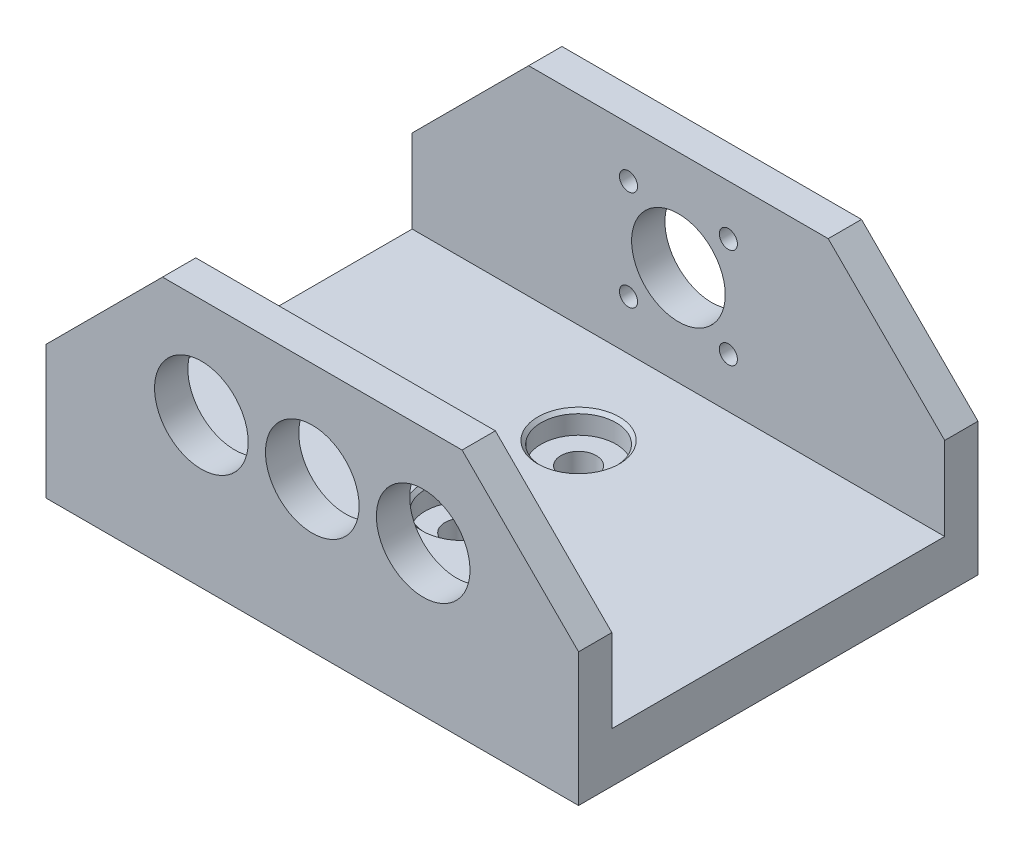
ISO-10303-21;
HEADER;
FILE_DESCRIPTION(('STEP AP214'),'2;1');
FILE_NAME('part.step','',(''),(''),'','','');
FILE_SCHEMA(('AUTOMOTIVE_DESIGN { 1 0 10303 214 1 1 1 1 }'));
ENDSEC;
DATA;
#1=APPLICATION_CONTEXT('core data for automotive mechanical design processes');
#2=APPLICATION_PROTOCOL_DEFINITION('international standard','automotive_design',2000,#1);
#3=PRODUCT_CONTEXT('',#1,'mechanical');
#4=PRODUCT('Part','Part','',(#3));
#5=PRODUCT_RELATED_PRODUCT_CATEGORY('part','',(#4));
#6=PRODUCT_DEFINITION_FORMATION('','',#4);
#7=PRODUCT_DEFINITION_CONTEXT('part definition',#1,'design');
#8=PRODUCT_DEFINITION('design','',#6,#7);
#9=PRODUCT_DEFINITION_SHAPE('','',#8);
#10=(LENGTH_UNIT() NAMED_UNIT(*) SI_UNIT(.MILLI.,.METRE.));
#11=(NAMED_UNIT(*) PLANE_ANGLE_UNIT() SI_UNIT($,.RADIAN.));
#12=(NAMED_UNIT(*) SI_UNIT($,.STERADIAN.) SOLID_ANGLE_UNIT());
#13=UNCERTAINTY_MEASURE_WITH_UNIT(LENGTH_MEASURE(1.E-05),#10,'distance_accuracy_value','');
#14=(GEOMETRIC_REPRESENTATION_CONTEXT(3) GLOBAL_UNCERTAINTY_ASSIGNED_CONTEXT((#13)) GLOBAL_UNIT_ASSIGNED_CONTEXT((#10,
#11,#12)) REPRESENTATION_CONTEXT('',''));
#15=CARTESIAN_POINT('',(0.,0.,0.));
#16=DIRECTION('',(0.,0.,1.));
#17=DIRECTION('',(1.,0.,0.));
#18=AXIS2_PLACEMENT_3D('',#15,#16,#17);
#19=CARTESIAN_POINT('',(0.,50.8,0.));
#20=DIRECTION('',(-1.,0.,0.));
#21=DIRECTION('',(0.,0.,1.));
#22=AXIS2_PLACEMENT_3D('',#19,#20,#21);
#23=PLANE('',#22);
#24=DIRECTION('',(0.,0.,1.));
#25=VECTOR('',#24,1.);
#26=CARTESIAN_POINT('',(0.,25.4,-76.2));
#27=LINE('',#26,#25);
#28=CARTESIAN_POINT('',(0.,25.4,-76.2));
#29=VERTEX_POINT('',#28);
#30=CARTESIAN_POINT('',(0.,25.4,-69.85));
#31=VERTEX_POINT('',#30);
#32=EDGE_CURVE('E57',#29,#31,#27,.T.);
#33=ORIENTED_EDGE('',*,*,#32,.F.);
#34=DIRECTION('',(0.,-1.,0.));
#35=VECTOR('',#34,1.);
#36=CARTESIAN_POINT('',(0.,50.8,-76.2));
#37=LINE('',#36,#35);
#38=CARTESIAN_POINT('',(0.,0.,-76.2));
#39=VERTEX_POINT('',#38);
#40=EDGE_CURVE('E134',#29,#39,#37,.T.);
#41=ORIENTED_EDGE('',*,*,#40,.T.);
#42=DIRECTION('',(0.,0.,-1.));
#43=VECTOR('',#42,1.);
#44=CARTESIAN_POINT('',(0.,0.,0.));
#45=LINE('',#44,#43);
#46=CARTESIAN_POINT('',(0.,0.,0.));
#47=VERTEX_POINT('',#46);
#48=EDGE_CURVE('E203',#47,#39,#45,.T.);
#49=ORIENTED_EDGE('',*,*,#48,.F.);
#50=DIRECTION('',(0.,-1.,0.));
#51=VECTOR('',#50,1.);
#52=CARTESIAN_POINT('',(0.,50.8,0.));
#53=LINE('',#52,#51);
#54=CARTESIAN_POINT('',(0.,25.4,0.));
#55=VERTEX_POINT('',#54);
#56=EDGE_CURVE('E162',#55,#47,#53,.T.);
#57=ORIENTED_EDGE('',*,*,#56,.F.);
#58=CARTESIAN_POINT('',(0.,25.4,-6.35000000000004));
#59=VERTEX_POINT('',#58);
#60=EDGE_CURVE('E138',#59,#55,#27,.T.);
#61=ORIENTED_EDGE('',*,*,#60,.F.);
#62=DIRECTION('',(0.,-1.,0.));
#63=VECTOR('',#62,1.);
#64=CARTESIAN_POINT('',(0.,50.8,-6.35));
#65=LINE('',#64,#63);
#66=CARTESIAN_POINT('',(0.,9.525,-6.35));
#67=VERTEX_POINT('',#66);
#68=EDGE_CURVE('E188',#59,#67,#65,.T.);
#69=ORIENTED_EDGE('',*,*,#68,.T.);
#70=DIRECTION('',(0.,0.,-1.));
#71=VECTOR('',#70,1.);
#72=CARTESIAN_POINT('',(0.,9.525,-6.35));
#73=LINE('',#72,#71);
#74=CARTESIAN_POINT('',(0.,9.525,-69.85));
#75=VERTEX_POINT('',#74);
#76=EDGE_CURVE('E201',#67,#75,#73,.T.);
#77=ORIENTED_EDGE('',*,*,#76,.T.);
#78=DIRECTION('',(0.,-1.,0.));
#79=VECTOR('',#78,1.);
#80=CARTESIAN_POINT('',(0.,50.8,-69.85));
#81=LINE('',#80,#79);
#82=EDGE_CURVE('E137',#31,#75,#81,.T.);
#83=ORIENTED_EDGE('',*,*,#82,.F.);
#84=EDGE_LOOP('',(#33,#41,#49,#57,#61,#69,#77,#83));
#85=FACE_BOUND('',#84,.T.);
#86=ADVANCED_FACE('F35',(#85),#23,.T.);
#87=CARTESIAN_POINT('',(0.,50.8,0.));
#88=DIRECTION('',(0.,0.,-1.));
#89=DIRECTION('',(-1.,0.,0.));
#90=AXIS2_PLACEMENT_3D('',#87,#88,#89);
#91=PLANE('',#90);
#92=CARTESIAN_POINT('',(29.6418,28.5242,0.));
#93=DIRECTION('',(0.,0.,1.));
#94=DIRECTION('',(1.,0.,0.));
#95=AXIS2_PLACEMENT_3D('',#92,#93,#94);
#96=CIRCLE('',#95,8.92975099999999);
#97=CARTESIAN_POINT('',(38.571551,28.5242,0.));
#98=VERTEX_POINT('',#97);
#99=EDGE_CURVE('E334',#98,#98,#96,.T.);
#100=ORIENTED_EDGE('',*,*,#99,.F.);
#101=EDGE_LOOP('',(#100));
#102=FACE_BOUND('',#101,.T.);
#103=CARTESIAN_POINT('',(71.9582,28.5242,0.));
#104=DIRECTION('',(0.,0.,1.));
#105=DIRECTION('',(1.,0.,0.));
#106=AXIS2_PLACEMENT_3D('',#103,#104,#105);
#107=CIRCLE('',#106,8.92975099999999);
#108=CARTESIAN_POINT('',(80.887951,28.5242,0.));
#109=VERTEX_POINT('',#108);
#110=EDGE_CURVE('E340',#109,#109,#107,.T.);
#111=ORIENTED_EDGE('',*,*,#110,.F.);
#112=EDGE_LOOP('',(#111));
#113=FACE_BOUND('',#112,.T.);
#114=CARTESIAN_POINT('',(50.8,28.5242,0.));
#115=DIRECTION('',(0.,0.,1.));
#116=DIRECTION('',(1.,0.,0.));
#117=AXIS2_PLACEMENT_3D('',#114,#115,#116);
#118=CIRCLE('',#117,8.92975099999999);
#119=CARTESIAN_POINT('',(59.729751,28.5242,0.));
#120=VERTEX_POINT('',#119);
#121=EDGE_CURVE('E346',#120,#120,#118,.T.);
#122=ORIENTED_EDGE('',*,*,#121,.F.);
#123=EDGE_LOOP('',(#122));
#124=FACE_BOUND('',#123,.T.);
#125=DIRECTION('',(0.,-1.,0.));
#126=VECTOR('',#125,1.);
#127=CARTESIAN_POINT('',(101.6,50.8,0.));
#128=LINE('',#127,#126);
#129=CARTESIAN_POINT('',(101.6,25.4,0.));
#130=VERTEX_POINT('',#129);
#131=CARTESIAN_POINT('',(101.6,0.,0.));
#132=VERTEX_POINT('',#131);
#133=EDGE_CURVE('E149',#130,#132,#128,.T.);
#134=ORIENTED_EDGE('',*,*,#133,.F.);
#135=DIRECTION('',(0.707106781186548,-0.707106781186547,0.));
#136=VECTOR('',#135,1.);
#137=CARTESIAN_POINT('',(79.3749999999999,47.625,0.));
#138=LINE('',#137,#136);
#139=CARTESIAN_POINT('',(79.3749999999999,47.625,0.));
#140=VERTEX_POINT('',#139);
#141=EDGE_CURVE('E129',#140,#130,#138,.T.);
#142=ORIENTED_EDGE('',*,*,#141,.F.);
#143=DIRECTION('',(1.,0.,0.));
#144=VECTOR('',#143,1.);
#145=CARTESIAN_POINT('',(22.2250000000001,47.625,0.));
#146=LINE('',#145,#144);
#147=CARTESIAN_POINT('',(22.2250000000001,47.625,0.));
#148=VERTEX_POINT('',#147);
#149=EDGE_CURVE('E292',#148,#140,#146,.T.);
#150=ORIENTED_EDGE('',*,*,#149,.F.);
#151=DIRECTION('',(0.707106781186549,0.707106781186546,0.));
#152=VECTOR('',#151,1.);
#153=CARTESIAN_POINT('',(0.,25.4,0.));
#154=LINE('',#153,#152);
#155=EDGE_CURVE('E283',#55,#148,#154,.T.);
#156=ORIENTED_EDGE('',*,*,#155,.F.);
#157=ORIENTED_EDGE('',*,*,#56,.T.);
#158=DIRECTION('',(1.,0.,0.));
#159=VECTOR('',#158,1.);
#160=CARTESIAN_POINT('',(0.,0.,0.));
#161=LINE('',#160,#159);
#162=EDGE_CURVE('E147',#47,#132,#161,.T.);
#163=ORIENTED_EDGE('',*,*,#162,.T.);
#164=EDGE_LOOP('',(#134,#142,#150,#156,#157,#163));
#165=FACE_BOUND('',#164,.T.);
#166=ADVANCED_FACE('F216',(#102,#113,#124,#165),#91,.F.);
#167=CARTESIAN_POINT('',(101.6,50.8,0.));
#168=DIRECTION('',(-1.,0.,0.));
#169=DIRECTION('',(0.,0.,1.));
#170=AXIS2_PLACEMENT_3D('',#167,#168,#169);
#171=PLANE('',#170);
#172=DIRECTION('',(0.,-1.,0.));
#173=VECTOR('',#172,1.);
#174=CARTESIAN_POINT('',(101.6,50.8,-76.2));
#175=LINE('',#174,#173);
#176=CARTESIAN_POINT('',(101.6,25.4,-76.2));
#177=VERTEX_POINT('',#176);
#178=CARTESIAN_POINT('',(101.6,0.,-76.2));
#179=VERTEX_POINT('',#178);
#180=EDGE_CURVE('E146',#177,#179,#175,.T.);
#181=ORIENTED_EDGE('',*,*,#180,.F.);
#182=DIRECTION('',(0.,0.,1.));
#183=VECTOR('',#182,1.);
#184=CARTESIAN_POINT('',(101.6,25.4,-76.2));
#185=LINE('',#184,#183);
#186=CARTESIAN_POINT('',(101.6,25.4,-69.85));
#187=VERTEX_POINT('',#186);
#188=EDGE_CURVE('E296',#177,#187,#185,.T.);
#189=ORIENTED_EDGE('',*,*,#188,.T.);
#190=DIRECTION('',(0.,1.,0.));
#191=VECTOR('',#190,1.);
#192=CARTESIAN_POINT('',(101.6,50.8,-69.85));
#193=LINE('',#192,#191);
#194=CARTESIAN_POINT('',(101.6,9.52500000000001,-69.85));
#195=VERTEX_POINT('',#194);
#196=EDGE_CURVE('E183',#195,#187,#193,.T.);
#197=ORIENTED_EDGE('',*,*,#196,.F.);
#198=DIRECTION('',(0.,0.,-1.));
#199=VECTOR('',#198,1.);
#200=CARTESIAN_POINT('',(101.6,9.52500000000001,-6.35));
#201=LINE('',#200,#199);
#202=CARTESIAN_POINT('',(101.6,9.52500000000001,-6.35));
#203=VERTEX_POINT('',#202);
#204=EDGE_CURVE('E199',#203,#195,#201,.T.);
#205=ORIENTED_EDGE('',*,*,#204,.F.);
#206=DIRECTION('',(0.,1.,0.));
#207=VECTOR('',#206,1.);
#208=CARTESIAN_POINT('',(101.6,50.8,-6.35));
#209=LINE('',#208,#207);
#210=CARTESIAN_POINT('',(101.6,25.4,-6.35000000000004));
#211=VERTEX_POINT('',#210);
#212=EDGE_CURVE('E196',#203,#211,#209,.T.);
#213=ORIENTED_EDGE('',*,*,#212,.T.);
#214=EDGE_CURVE('E175',#211,#130,#185,.T.);
#215=ORIENTED_EDGE('',*,*,#214,.T.);
#216=ORIENTED_EDGE('',*,*,#133,.T.);
#217=DIRECTION('',(0.,0.,-1.));
#218=VECTOR('',#217,1.);
#219=CARTESIAN_POINT('',(101.6,0.,0.));
#220=LINE('',#219,#218);
#221=EDGE_CURVE('E152',#132,#179,#220,.T.);
#222=ORIENTED_EDGE('',*,*,#221,.T.);
#223=EDGE_LOOP('',(#181,#189,#197,#205,#213,#215,#216,#222));
#224=FACE_BOUND('',#223,.T.);
#225=ADVANCED_FACE('F211',(#224),#171,.F.);
#226=CARTESIAN_POINT('',(0.,50.8,-76.2));
#227=DIRECTION('',(0.,0.,-1.));
#228=DIRECTION('',(-1.,0.,0.));
#229=AXIS2_PLACEMENT_3D('',#226,#227,#228);
#230=PLANE('',#229);
#231=CARTESIAN_POINT('',(41.275,38.0492,-76.2));
#232=DIRECTION('',(0.,0.,-1.));
#233=DIRECTION('',(-1.,0.,0.));
#234=AXIS2_PLACEMENT_3D('',#231,#232,#233);
#235=CIRCLE('',#234,1.72719999999998);
#236=CARTESIAN_POINT('',(39.5478,38.0492,-76.2));
#237=VERTEX_POINT('',#236);
#238=EDGE_CURVE('E266',#237,#237,#235,.T.);
#239=ORIENTED_EDGE('',*,*,#238,.F.);
#240=EDGE_LOOP('',(#239));
#241=FACE_BOUND('',#240,.T.);
#242=CARTESIAN_POINT('',(60.325,18.9992,-76.2));
#243=DIRECTION('',(0.,0.,-1.));
#244=DIRECTION('',(-1.,0.,0.));
#245=AXIS2_PLACEMENT_3D('',#242,#243,#244);
#246=CIRCLE('',#245,1.72719999999999);
#247=CARTESIAN_POINT('',(58.5978,18.9992,-76.2));
#248=VERTEX_POINT('',#247);
#249=EDGE_CURVE('E270',#248,#248,#246,.T.);
#250=ORIENTED_EDGE('',*,*,#249,.F.);
#251=EDGE_LOOP('',(#250));
#252=FACE_BOUND('',#251,.T.);
#253=CARTESIAN_POINT('',(60.325,38.0492,-76.2));
#254=DIRECTION('',(0.,0.,-1.));
#255=DIRECTION('',(-1.,0.,0.));
#256=AXIS2_PLACEMENT_3D('',#253,#254,#255);
#257=CIRCLE('',#256,1.72719999999999);
#258=CARTESIAN_POINT('',(58.5978,38.0492,-76.2));
#259=VERTEX_POINT('',#258);
#260=EDGE_CURVE('E274',#259,#259,#257,.T.);
#261=ORIENTED_EDGE('',*,*,#260,.F.);
#262=EDGE_LOOP('',(#261));
#263=FACE_BOUND('',#262,.T.);
#264=CARTESIAN_POINT('',(41.275,18.9992,-76.2));
#265=DIRECTION('',(0.,0.,-1.));
#266=DIRECTION('',(-1.,0.,0.));
#267=AXIS2_PLACEMENT_3D('',#264,#265,#266);
#268=CIRCLE('',#267,1.72719999999998);
#269=CARTESIAN_POINT('',(39.5478,18.9992,-76.2));
#270=VERTEX_POINT('',#269);
#271=EDGE_CURVE('E277',#270,#270,#268,.T.);
#272=ORIENTED_EDGE('',*,*,#271,.F.);
#273=EDGE_LOOP('',(#272));
#274=FACE_BOUND('',#273,.T.);
#275=DIRECTION('',(0.707106781186548,-0.707106781186547,0.));
#276=VECTOR('',#275,1.);
#277=CARTESIAN_POINT('',(79.3749999999999,47.625,-76.2));
#278=LINE('',#277,#276);
#279=CARTESIAN_POINT('',(79.3749999999999,47.625,-76.2));
#280=VERTEX_POINT('',#279);
#281=EDGE_CURVE('E174',#280,#177,#278,.T.);
#282=ORIENTED_EDGE('',*,*,#281,.T.);
#283=ORIENTED_EDGE('',*,*,#180,.T.);
#284=DIRECTION('',(1.,0.,0.));
#285=VECTOR('',#284,1.);
#286=CARTESIAN_POINT('',(0.,0.,-76.2));
#287=LINE('',#286,#285);
#288=EDGE_CURVE('E144',#39,#179,#287,.T.);
#289=ORIENTED_EDGE('',*,*,#288,.F.);
#290=ORIENTED_EDGE('',*,*,#40,.F.);
#291=DIRECTION('',(0.707106781186549,0.707106781186546,0.));
#292=VECTOR('',#291,1.);
#293=CARTESIAN_POINT('',(0.,25.4,-76.2));
#294=LINE('',#293,#292);
#295=CARTESIAN_POINT('',(22.2250000000001,47.625,-76.2));
#296=VERTEX_POINT('',#295);
#297=EDGE_CURVE('E120',#29,#296,#294,.T.);
#298=ORIENTED_EDGE('',*,*,#297,.T.);
#299=DIRECTION('',(1.,0.,0.));
#300=VECTOR('',#299,1.);
#301=CARTESIAN_POINT('',(22.2250000000001,47.625,-76.2));
#302=LINE('',#301,#300);
#303=EDGE_CURVE('E128',#296,#280,#302,.T.);
#304=ORIENTED_EDGE('',*,*,#303,.T.);
#305=EDGE_LOOP('',(#282,#283,#289,#290,#298,#304));
#306=FACE_BOUND('',#305,.T.);
#307=CARTESIAN_POINT('',(50.8,28.5242,-76.2));
#308=DIRECTION('',(0.,0.,1.));
#309=DIRECTION('',(1.,0.,0.));
#310=AXIS2_PLACEMENT_3D('',#307,#308,#309);
#311=CIRCLE('',#310,8.92975099999999);
#312=CARTESIAN_POINT('',(59.729751,28.5242,-76.2));
#313=VERTEX_POINT('',#312);
#314=EDGE_CURVE('E160',#313,#313,#311,.T.);
#315=ORIENTED_EDGE('',*,*,#314,.T.);
#316=EDGE_LOOP('',(#315));
#317=FACE_BOUND('',#316,.T.);
#318=ADVANCED_FACE('F141',(#241,#252,#263,#274,#306,#317),#230,.T.);
#319=CARTESIAN_POINT('',(0.,0.,0.));
#320=DIRECTION('',(0.,-1.,0.));
#321=DIRECTION('',(0.,0.,-1.));
#322=AXIS2_PLACEMENT_3D('',#319,#320,#321);
#323=PLANE('',#322);
#324=CARTESIAN_POINT('',(50.8,0.,-50.8));
#325=DIRECTION('',(0.,1.,0.));
#326=DIRECTION('',(0.,0.,1.));
#327=AXIS2_PLACEMENT_3D('',#324,#325,#326);
#328=CIRCLE('',#327,3.3782);
#329=CARTESIAN_POINT('',(50.8,0.,-47.4218));
#330=VERTEX_POINT('',#329);
#331=EDGE_CURVE('E316',#330,#330,#328,.T.);
#332=ORIENTED_EDGE('',*,*,#331,.T.);
#333=EDGE_LOOP('',(#332));
#334=FACE_BOUND('',#333,.T.);
#335=CARTESIAN_POINT('',(50.8,0.,-28.702));
#336=DIRECTION('',(0.,1.,0.));
#337=DIRECTION('',(0.,0.,1.));
#338=AXIS2_PLACEMENT_3D('',#335,#336,#337);
#339=CIRCLE('',#338,3.3782);
#340=CARTESIAN_POINT('',(50.8,0.,-25.3238));
#341=VERTEX_POINT('',#340);
#342=EDGE_CURVE('E331',#341,#341,#339,.T.);
#343=ORIENTED_EDGE('',*,*,#342,.T.);
#344=EDGE_LOOP('',(#343));
#345=FACE_BOUND('',#344,.T.);
#346=ORIENTED_EDGE('',*,*,#48,.T.);
#347=ORIENTED_EDGE('',*,*,#288,.T.);
#348=ORIENTED_EDGE('',*,*,#221,.F.);
#349=ORIENTED_EDGE('',*,*,#162,.F.);
#350=EDGE_LOOP('',(#346,#347,#348,#349));
#351=FACE_BOUND('',#350,.T.);
#352=ADVANCED_FACE('F220',(#334,#345,#351),#323,.T.);
#353=CARTESIAN_POINT('',(0.,9.525,-6.35));
#354=DIRECTION('',(0.,1.,0.));
#355=DIRECTION('',(-1.,0.,0.));
#356=AXIS2_PLACEMENT_3D('',#353,#354,#355);
#357=PLANE('',#356);
#358=CARTESIAN_POINT('',(50.8,9.52500000000001,-50.8));
#359=DIRECTION('',(0.,1.,0.));
#360=DIRECTION('',(0.,0.,1.));
#361=AXIS2_PLACEMENT_3D('',#358,#359,#360);
#362=CIRCLE('',#361,7.77875);
#363=CARTESIAN_POINT('',(50.8,9.52500000000001,-43.02125));
#364=VERTEX_POINT('',#363);
#365=EDGE_CURVE('E304',#364,#364,#362,.T.);
#366=ORIENTED_EDGE('',*,*,#365,.F.);
#367=EDGE_LOOP('',(#366));
#368=FACE_BOUND('',#367,.T.);
#369=CARTESIAN_POINT('',(50.8,9.52500000000001,-28.702));
#370=DIRECTION('',(0.,1.,0.));
#371=DIRECTION('',(0.,0.,1.));
#372=AXIS2_PLACEMENT_3D('',#369,#370,#371);
#373=CIRCLE('',#372,7.77875);
#374=CARTESIAN_POINT('',(50.8,9.52500000000001,-20.92325));
#375=VERTEX_POINT('',#374);
#376=EDGE_CURVE('E319',#375,#375,#373,.T.);
#377=ORIENTED_EDGE('',*,*,#376,.F.);
#378=EDGE_LOOP('',(#377));
#379=FACE_BOUND('',#378,.T.);
#380=ORIENTED_EDGE('',*,*,#76,.F.);
#381=DIRECTION('',(1.,0.,0.));
#382=VECTOR('',#381,1.);
#383=CARTESIAN_POINT('',(0.,9.525,-6.35));
#384=LINE('',#383,#382);
#385=EDGE_CURVE('E190',#67,#203,#384,.T.);
#386=ORIENTED_EDGE('',*,*,#385,.T.);
#387=ORIENTED_EDGE('',*,*,#204,.T.);
#388=DIRECTION('',(1.,0.,0.));
#389=VECTOR('',#388,1.);
#390=CARTESIAN_POINT('',(0.,9.525,-69.85));
#391=LINE('',#390,#389);
#392=EDGE_CURVE('E185',#75,#195,#391,.T.);
#393=ORIENTED_EDGE('',*,*,#392,.F.);
#394=EDGE_LOOP('',(#380,#386,#387,#393));
#395=FACE_BOUND('',#394,.T.);
#396=ADVANCED_FACE('F233',(#368,#379,#395),#357,.T.);
#397=CARTESIAN_POINT('',(0.,0.,-6.35));
#398=DIRECTION('',(0.,0.,1.));
#399=DIRECTION('',(1.,0.,0.));
#400=AXIS2_PLACEMENT_3D('',#397,#398,#399);
#401=PLANE('',#400);
#402=CARTESIAN_POINT('',(29.6418,28.5242,-6.35));
#403=DIRECTION('',(0.,0.,1.));
#404=DIRECTION('',(1.,0.,0.));
#405=AXIS2_PLACEMENT_3D('',#402,#403,#404);
#406=CIRCLE('',#405,8.92975099999999);
#407=CARTESIAN_POINT('',(38.571551,28.5242,-6.35));
#408=VERTEX_POINT('',#407);
#409=EDGE_CURVE('E337',#408,#408,#406,.T.);
#410=ORIENTED_EDGE('',*,*,#409,.T.);
#411=EDGE_LOOP('',(#410));
#412=FACE_BOUND('',#411,.T.);
#413=CARTESIAN_POINT('',(71.9582,28.5242,-6.35));
#414=DIRECTION('',(0.,0.,1.));
#415=DIRECTION('',(1.,0.,0.));
#416=AXIS2_PLACEMENT_3D('',#413,#414,#415);
#417=CIRCLE('',#416,8.92975099999999);
#418=CARTESIAN_POINT('',(80.887951,28.5242,-6.35));
#419=VERTEX_POINT('',#418);
#420=EDGE_CURVE('E343',#419,#419,#417,.T.);
#421=ORIENTED_EDGE('',*,*,#420,.T.);
#422=EDGE_LOOP('',(#421));
#423=FACE_BOUND('',#422,.T.);
#424=CARTESIAN_POINT('',(50.8,28.5242,-6.35));
#425=DIRECTION('',(0.,0.,1.));
#426=DIRECTION('',(1.,0.,0.));
#427=AXIS2_PLACEMENT_3D('',#424,#425,#426);
#428=CIRCLE('',#427,8.92975099999999);
#429=CARTESIAN_POINT('',(59.729751,28.5242,-6.35));
#430=VERTEX_POINT('',#429);
#431=EDGE_CURVE('E159',#430,#430,#428,.T.);
#432=ORIENTED_EDGE('',*,*,#431,.T.);
#433=EDGE_LOOP('',(#432));
#434=FACE_BOUND('',#433,.T.);
#435=DIRECTION('',(1.,0.,0.));
#436=VECTOR('',#435,1.);
#437=CARTESIAN_POINT('',(0.,47.625,-6.35));
#438=LINE('',#437,#436);
#439=CARTESIAN_POINT('',(22.2250000000001,47.625,-6.35));
#440=VERTEX_POINT('',#439);
#441=CARTESIAN_POINT('',(79.3749999999999,47.625,-6.35000000000004));
#442=VERTEX_POINT('',#441);
#443=EDGE_CURVE('E300',#440,#442,#438,.T.);
#444=ORIENTED_EDGE('',*,*,#443,.T.);
#445=DIRECTION('',(0.707106781186548,-0.707106781186547,0.));
#446=VECTOR('',#445,1.);
#447=CARTESIAN_POINT('',(63.4999999999999,63.5,-6.35));
#448=LINE('',#447,#446);
#449=EDGE_CURVE('E302',#442,#211,#448,.T.);
#450=ORIENTED_EDGE('',*,*,#449,.T.);
#451=ORIENTED_EDGE('',*,*,#212,.F.);
#452=ORIENTED_EDGE('',*,*,#385,.F.);
#453=ORIENTED_EDGE('',*,*,#68,.F.);
#454=DIRECTION('',(0.707106781186549,0.707106781186546,0.));
#455=VECTOR('',#454,1.);
#456=CARTESIAN_POINT('',(-12.7,12.7,-6.35));
#457=LINE('',#456,#455);
#458=EDGE_CURVE('E228',#59,#440,#457,.T.);
#459=ORIENTED_EDGE('',*,*,#458,.T.);
#460=EDGE_LOOP('',(#444,#450,#451,#452,#453,#459));
#461=FACE_BOUND('',#460,.T.);
#462=ADVANCED_FACE('F227',(#412,#423,#434,#461),#401,.F.);
#463=CARTESIAN_POINT('',(0.,0.,-69.85));
#464=DIRECTION('',(0.,0.,1.));
#465=DIRECTION('',(1.,0.,0.));
#466=AXIS2_PLACEMENT_3D('',#463,#464,#465);
#467=PLANE('',#466);
#468=CARTESIAN_POINT('',(41.275,38.0492,-69.85));
#469=DIRECTION('',(0.,0.,1.));
#470=DIRECTION('',(1.,0.,0.));
#471=AXIS2_PLACEMENT_3D('',#468,#469,#470);
#472=CIRCLE('',#471,1.72719999999999);
#473=CARTESIAN_POINT('',(43.0022,38.0492,-69.85));
#474=VERTEX_POINT('',#473);
#475=EDGE_CURVE('E378',#474,#474,#472,.T.);
#476=ORIENTED_EDGE('',*,*,#475,.F.);
#477=EDGE_LOOP('',(#476));
#478=FACE_BOUND('',#477,.T.);
#479=CARTESIAN_POINT('',(60.325,18.9992,-69.85));
#480=DIRECTION('',(0.,0.,1.));
#481=DIRECTION('',(1.,0.,0.));
#482=AXIS2_PLACEMENT_3D('',#479,#480,#481);
#483=CIRCLE('',#482,1.72719999999999);
#484=CARTESIAN_POINT('',(62.0522,18.9992,-69.85));
#485=VERTEX_POINT('',#484);
#486=EDGE_CURVE('E382',#485,#485,#483,.T.);
#487=ORIENTED_EDGE('',*,*,#486,.F.);
#488=EDGE_LOOP('',(#487));
#489=FACE_BOUND('',#488,.T.);
#490=CARTESIAN_POINT('',(60.325,38.0492,-69.85));
#491=DIRECTION('',(0.,0.,1.));
#492=DIRECTION('',(1.,0.,0.));
#493=AXIS2_PLACEMENT_3D('',#490,#491,#492);
#494=CIRCLE('',#493,1.72719999999999);
#495=CARTESIAN_POINT('',(62.0522,38.0492,-69.85));
#496=VERTEX_POINT('',#495);
#497=EDGE_CURVE('E280',#496,#496,#494,.T.);
#498=ORIENTED_EDGE('',*,*,#497,.F.);
#499=EDGE_LOOP('',(#498));
#500=FACE_BOUND('',#499,.T.);
#501=CARTESIAN_POINT('',(41.275,18.9992,-69.85));
#502=DIRECTION('',(0.,0.,1.));
#503=DIRECTION('',(1.,0.,0.));
#504=AXIS2_PLACEMENT_3D('',#501,#502,#503);
#505=CIRCLE('',#504,1.72719999999999);
#506=CARTESIAN_POINT('',(43.0022,18.9992,-69.85));
#507=VERTEX_POINT('',#506);
#508=EDGE_CURVE('E279',#507,#507,#505,.T.);
#509=ORIENTED_EDGE('',*,*,#508,.F.);
#510=EDGE_LOOP('',(#509));
#511=FACE_BOUND('',#510,.T.);
#512=DIRECTION('',(0.707106781186548,-0.707106781186547,0.));
#513=VECTOR('',#512,1.);
#514=CARTESIAN_POINT('',(63.4999999999999,63.5,-69.85));
#515=LINE('',#514,#513);
#516=CARTESIAN_POINT('',(79.3749999999999,47.625,-69.85));
#517=VERTEX_POINT('',#516);
#518=EDGE_CURVE('E11',#517,#187,#515,.T.);
#519=ORIENTED_EDGE('',*,*,#518,.F.);
#520=DIRECTION('',(1.,0.,0.));
#521=VECTOR('',#520,1.);
#522=CARTESIAN_POINT('',(0.,47.625,-69.85));
#523=LINE('',#522,#521);
#524=CARTESIAN_POINT('',(22.2250000000001,47.625,-69.85));
#525=VERTEX_POINT('',#524);
#526=EDGE_CURVE('E42',#525,#517,#523,.T.);
#527=ORIENTED_EDGE('',*,*,#526,.F.);
#528=DIRECTION('',(0.707106781186549,0.707106781186546,0.));
#529=VECTOR('',#528,1.);
#530=CARTESIAN_POINT('',(-12.7,12.7,-69.85));
#531=LINE('',#530,#529);
#532=EDGE_CURVE('E161',#31,#525,#531,.T.);
#533=ORIENTED_EDGE('',*,*,#532,.F.);
#534=ORIENTED_EDGE('',*,*,#82,.T.);
#535=ORIENTED_EDGE('',*,*,#392,.T.);
#536=ORIENTED_EDGE('',*,*,#196,.T.);
#537=EDGE_LOOP('',(#519,#527,#533,#534,#535,#536));
#538=FACE_BOUND('',#537,.T.);
#539=CARTESIAN_POINT('',(50.8,28.5242,-69.85));
#540=DIRECTION('',(0.,0.,1.));
#541=DIRECTION('',(1.,0.,0.));
#542=AXIS2_PLACEMENT_3D('',#539,#540,#541);
#543=CIRCLE('',#542,8.92975099999999);
#544=CARTESIAN_POINT('',(59.729751,28.5242,-69.85));
#545=VERTEX_POINT('',#544);
#546=EDGE_CURVE('E156',#545,#545,#543,.T.);
#547=ORIENTED_EDGE('',*,*,#546,.F.);
#548=EDGE_LOOP('',(#547));
#549=FACE_BOUND('',#548,.T.);
#550=ADVANCED_FACE('F179',(#478,#489,#500,#511,#538,#549),#467,.T.);
#551=CARTESIAN_POINT('',(50.8,28.5242,0.));
#552=DIRECTION('',(0.,0.,1.));
#553=DIRECTION('',(1.,0.,0.));
#554=AXIS2_PLACEMENT_3D('',#551,#552,#553);
#555=CYLINDRICAL_SURFACE('',#554,8.92975099999999);
#556=ORIENTED_EDGE('',*,*,#546,.T.);
#557=EDGE_LOOP('',(#556));
#558=FACE_BOUND('',#557,.T.);
#559=ORIENTED_EDGE('',*,*,#314,.F.);
#560=EDGE_LOOP('',(#559));
#561=FACE_BOUND('',#560,.T.);
#562=ADVANCED_FACE('F358',(#558,#561),#555,.F.);
#563=ORIENTED_EDGE('',*,*,#121,.T.);
#564=EDGE_LOOP('',(#563));
#565=FACE_BOUND('',#564,.T.);
#566=ORIENTED_EDGE('',*,*,#431,.F.);
#567=EDGE_LOOP('',(#566));
#568=FACE_BOUND('',#567,.T.);
#569=ADVANCED_FACE('F355',(#565,#568),#555,.F.);
#570=CARTESIAN_POINT('',(71.9582,28.5242,0.));
#571=DIRECTION('',(0.,0.,1.));
#572=DIRECTION('',(1.,0.,0.));
#573=AXIS2_PLACEMENT_3D('',#570,#571,#572);
#574=CYLINDRICAL_SURFACE('',#573,8.92975099999999);
#575=ORIENTED_EDGE('',*,*,#110,.T.);
#576=EDGE_LOOP('',(#575));
#577=FACE_BOUND('',#576,.T.);
#578=ORIENTED_EDGE('',*,*,#420,.F.);
#579=EDGE_LOOP('',(#578));
#580=FACE_BOUND('',#579,.T.);
#581=ADVANCED_FACE('F357',(#577,#580),#574,.F.);
#582=CARTESIAN_POINT('',(29.6418,28.5242,0.));
#583=DIRECTION('',(0.,0.,1.));
#584=DIRECTION('',(1.,0.,0.));
#585=AXIS2_PLACEMENT_3D('',#582,#583,#584);
#586=CYLINDRICAL_SURFACE('',#585,8.92975099999999);
#587=ORIENTED_EDGE('',*,*,#99,.T.);
#588=EDGE_LOOP('',(#587));
#589=FACE_BOUND('',#588,.T.);
#590=ORIENTED_EDGE('',*,*,#409,.F.);
#591=EDGE_LOOP('',(#590));
#592=FACE_BOUND('',#591,.T.);
#593=ADVANCED_FACE('F365',(#589,#592),#586,.F.);
#594=CARTESIAN_POINT('',(50.8,9.525,-28.702));
#595=DIRECTION('',(0.,1.,0.));
#596=DIRECTION('',(0.,0.,1.));
#597=AXIS2_PLACEMENT_3D('',#594,#595,#596);
#598=CYLINDRICAL_SURFACE('',#597,3.3782);
#599=ORIENTED_EDGE('',*,*,#342,.F.);
#600=EDGE_LOOP('',(#599));
#601=FACE_BOUND('',#600,.T.);
#602=CARTESIAN_POINT('',(50.8,5.334,-28.702));
#603=DIRECTION('',(0.,1.,0.));
#604=DIRECTION('',(0.,0.,1.));
#605=AXIS2_PLACEMENT_3D('',#602,#603,#604);
#606=CIRCLE('',#605,3.3782);
#607=CARTESIAN_POINT('',(50.8,5.334,-25.3238));
#608=VERTEX_POINT('',#607);
#609=EDGE_CURVE('E328',#608,#608,#606,.T.);
#610=ORIENTED_EDGE('',*,*,#609,.T.);
#611=EDGE_LOOP('',(#610));
#612=FACE_BOUND('',#611,.T.);
#613=ADVANCED_FACE('F436',(#601,#612),#598,.F.);
#614=CARTESIAN_POINT('',(57.94375,5.334,-28.702));
#615=DIRECTION('',(0.,-1.,0.));
#616=DIRECTION('',(0.,0.,-1.));
#617=AXIS2_PLACEMENT_3D('',#614,#615,#616);
#618=PLANE('',#617);
#619=ORIENTED_EDGE('',*,*,#609,.F.);
#620=EDGE_LOOP('',(#619));
#621=FACE_BOUND('',#620,.T.);
#622=CARTESIAN_POINT('',(50.8,5.334,-28.702));
#623=DIRECTION('',(0.,1.,0.));
#624=DIRECTION('',(0.,0.,1.));
#625=AXIS2_PLACEMENT_3D('',#622,#623,#624);
#626=CIRCLE('',#625,7.14375);
#627=CARTESIAN_POINT('',(50.8,5.334,-21.55825));
#628=VERTEX_POINT('',#627);
#629=EDGE_CURVE('E325',#628,#628,#626,.T.);
#630=ORIENTED_EDGE('',*,*,#629,.T.);
#631=EDGE_LOOP('',(#630));
#632=FACE_BOUND('',#631,.T.);
#633=ADVANCED_FACE('F432',(#621,#632),#618,.F.);
#634=CARTESIAN_POINT('',(50.8,9.525,-28.702));
#635=DIRECTION('',(0.,1.,0.));
#636=DIRECTION('',(0.,0.,1.));
#637=AXIS2_PLACEMENT_3D('',#634,#635,#636);
#638=CYLINDRICAL_SURFACE('',#637,7.14375);
#639=ORIENTED_EDGE('',*,*,#629,.F.);
#640=EDGE_LOOP('',(#639));
#641=FACE_BOUND('',#640,.T.);
#642=CARTESIAN_POINT('',(50.8,8.89000000000001,-28.702));
#643=DIRECTION('',(0.,1.,0.));
#644=DIRECTION('',(0.,0.,1.));
#645=AXIS2_PLACEMENT_3D('',#642,#643,#644);
#646=CIRCLE('',#645,7.14375);
#647=CARTESIAN_POINT('',(50.8,8.89000000000001,-21.55825));
#648=VERTEX_POINT('',#647);
#649=EDGE_CURVE('E322',#648,#648,#646,.T.);
#650=ORIENTED_EDGE('',*,*,#649,.T.);
#651=EDGE_LOOP('',(#650));
#652=FACE_BOUND('',#651,.T.);
#653=ADVANCED_FACE('F428',(#641,#652),#638,.F.);
#654=CARTESIAN_POINT('',(50.8,9.52500000000001,-28.702));
#655=DIRECTION('',(0.,1.,0.));
#656=DIRECTION('',(0.,0.,1.));
#657=AXIS2_PLACEMENT_3D('',#654,#655,#656);
#658=CONICAL_SURFACE('',#657,7.77875,0.785398163397446);
#659=ORIENTED_EDGE('',*,*,#649,.F.);
#660=EDGE_LOOP('',(#659));
#661=FACE_BOUND('',#660,.T.);
#662=ORIENTED_EDGE('',*,*,#376,.T.);
#663=EDGE_LOOP('',(#662));
#664=FACE_BOUND('',#663,.T.);
#665=ADVANCED_FACE('F424',(#661,#664),#658,.F.);
#666=CARTESIAN_POINT('',(50.8,9.525,-50.8));
#667=DIRECTION('',(0.,1.,0.));
#668=DIRECTION('',(0.,0.,1.));
#669=AXIS2_PLACEMENT_3D('',#666,#667,#668);
#670=CYLINDRICAL_SURFACE('',#669,3.3782);
#671=ORIENTED_EDGE('',*,*,#331,.F.);
#672=EDGE_LOOP('',(#671));
#673=FACE_BOUND('',#672,.T.);
#674=CARTESIAN_POINT('',(50.8,5.334,-50.8));
#675=DIRECTION('',(0.,1.,0.));
#676=DIRECTION('',(0.,0.,1.));
#677=AXIS2_PLACEMENT_3D('',#674,#675,#676);
#678=CIRCLE('',#677,3.3782);
#679=CARTESIAN_POINT('',(50.8,5.334,-47.4218));
#680=VERTEX_POINT('',#679);
#681=EDGE_CURVE('E313',#680,#680,#678,.T.);
#682=ORIENTED_EDGE('',*,*,#681,.T.);
#683=EDGE_LOOP('',(#682));
#684=FACE_BOUND('',#683,.T.);
#685=ADVANCED_FACE('F420',(#673,#684),#670,.F.);
#686=CARTESIAN_POINT('',(57.94375,5.334,-50.8));
#687=DIRECTION('',(0.,-1.,0.));
#688=DIRECTION('',(0.,0.,-1.));
#689=AXIS2_PLACEMENT_3D('',#686,#687,#688);
#690=PLANE('',#689);
#691=ORIENTED_EDGE('',*,*,#681,.F.);
#692=EDGE_LOOP('',(#691));
#693=FACE_BOUND('',#692,.T.);
#694=CARTESIAN_POINT('',(50.8,5.334,-50.8));
#695=DIRECTION('',(0.,1.,0.));
#696=DIRECTION('',(0.,0.,1.));
#697=AXIS2_PLACEMENT_3D('',#694,#695,#696);
#698=CIRCLE('',#697,7.14375);
#699=CARTESIAN_POINT('',(50.8,5.334,-43.65625));
#700=VERTEX_POINT('',#699);
#701=EDGE_CURVE('E310',#700,#700,#698,.T.);
#702=ORIENTED_EDGE('',*,*,#701,.T.);
#703=EDGE_LOOP('',(#702));
#704=FACE_BOUND('',#703,.T.);
#705=ADVANCED_FACE('F416',(#693,#704),#690,.F.);
#706=CARTESIAN_POINT('',(50.8,9.525,-50.8));
#707=DIRECTION('',(0.,1.,0.));
#708=DIRECTION('',(0.,0.,1.));
#709=AXIS2_PLACEMENT_3D('',#706,#707,#708);
#710=CYLINDRICAL_SURFACE('',#709,7.14375);
#711=ORIENTED_EDGE('',*,*,#701,.F.);
#712=EDGE_LOOP('',(#711));
#713=FACE_BOUND('',#712,.T.);
#714=CARTESIAN_POINT('',(50.8,8.89000000000001,-50.8));
#715=DIRECTION('',(0.,1.,0.));
#716=DIRECTION('',(0.,0.,1.));
#717=AXIS2_PLACEMENT_3D('',#714,#715,#716);
#718=CIRCLE('',#717,7.14375);
#719=CARTESIAN_POINT('',(50.8,8.89000000000001,-43.65625));
#720=VERTEX_POINT('',#719);
#721=EDGE_CURVE('E307',#720,#720,#718,.T.);
#722=ORIENTED_EDGE('',*,*,#721,.T.);
#723=EDGE_LOOP('',(#722));
#724=FACE_BOUND('',#723,.T.);
#725=ADVANCED_FACE('F412',(#713,#724),#710,.F.);
#726=CARTESIAN_POINT('',(50.8,9.52500000000001,-50.8));
#727=DIRECTION('',(0.,1.,0.));
#728=DIRECTION('',(0.,0.,1.));
#729=AXIS2_PLACEMENT_3D('',#726,#727,#728);
#730=CONICAL_SURFACE('',#729,7.77875,0.785398163397451);
#731=ORIENTED_EDGE('',*,*,#721,.F.);
#732=EDGE_LOOP('',(#731));
#733=FACE_BOUND('',#732,.T.);
#734=ORIENTED_EDGE('',*,*,#365,.T.);
#735=EDGE_LOOP('',(#734));
#736=FACE_BOUND('',#735,.T.);
#737=ADVANCED_FACE('F409',(#733,#736),#730,.F.);
#738=CARTESIAN_POINT('',(0.,25.4,-76.2));
#739=DIRECTION('',(0.707106781186546,-0.707106781186549,0.));
#740=DIRECTION('',(0.707106781186549,0.707106781186546,0.));
#741=AXIS2_PLACEMENT_3D('',#738,#739,#740);
#742=PLANE('',#741);
#743=ORIENTED_EDGE('',*,*,#532,.T.);
#744=DIRECTION('',(0.,0.,1.));
#745=VECTOR('',#744,1.);
#746=CARTESIAN_POINT('',(22.2250000000001,47.625,-76.2));
#747=LINE('',#746,#745);
#748=EDGE_CURVE('E123',#296,#525,#747,.T.);
#749=ORIENTED_EDGE('',*,*,#748,.F.);
#750=ORIENTED_EDGE('',*,*,#297,.F.);
#751=ORIENTED_EDGE('',*,*,#32,.T.);
#752=EDGE_LOOP('',(#743,#749,#750,#751));
#753=FACE_BOUND('',#752,.T.);
#754=ADVANCED_FACE('F121',(#753),#742,.F.);
#755=CARTESIAN_POINT('',(22.2250000000001,47.625,-76.2));
#756=DIRECTION('',(0.,-1.,0.));
#757=DIRECTION('',(1.,0.,0.));
#758=AXIS2_PLACEMENT_3D('',#755,#756,#757);
#759=PLANE('',#758);
#760=ORIENTED_EDGE('',*,*,#526,.T.);
#761=DIRECTION('',(0.,0.,1.));
#762=VECTOR('',#761,1.);
#763=CARTESIAN_POINT('',(79.3749999999999,47.625,-76.2));
#764=LINE('',#763,#762);
#765=EDGE_CURVE('E167',#280,#517,#764,.T.);
#766=ORIENTED_EDGE('',*,*,#765,.F.);
#767=ORIENTED_EDGE('',*,*,#303,.F.);
#768=ORIENTED_EDGE('',*,*,#748,.T.);
#769=EDGE_LOOP('',(#760,#766,#767,#768));
#770=FACE_BOUND('',#769,.T.);
#771=ADVANCED_FACE('F166',(#770),#759,.F.);
#772=CARTESIAN_POINT('',(79.3749999999999,47.625,-76.2));
#773=DIRECTION('',(-0.707106781186547,-0.707106781186548,0.));
#774=DIRECTION('',(0.707106781186548,-0.707106781186547,0.));
#775=AXIS2_PLACEMENT_3D('',#772,#773,#774);
#776=PLANE('',#775);
#777=ORIENTED_EDGE('',*,*,#518,.T.);
#778=ORIENTED_EDGE('',*,*,#188,.F.);
#779=ORIENTED_EDGE('',*,*,#281,.F.);
#780=ORIENTED_EDGE('',*,*,#765,.T.);
#781=EDGE_LOOP('',(#777,#778,#779,#780));
#782=FACE_BOUND('',#781,.T.);
#783=ADVANCED_FACE('F172',(#782),#776,.F.);
#784=EDGE_CURVE('E176',#442,#140,#764,.T.);
#785=ORIENTED_EDGE('',*,*,#784,.T.);
#786=ORIENTED_EDGE('',*,*,#141,.T.);
#787=ORIENTED_EDGE('',*,*,#214,.F.);
#788=ORIENTED_EDGE('',*,*,#449,.F.);
#789=EDGE_LOOP('',(#785,#786,#787,#788));
#790=FACE_BOUND('',#789,.T.);
#791=ADVANCED_FACE('F405',(#790),#776,.F.);
#792=EDGE_CURVE('E49',#440,#148,#747,.T.);
#793=ORIENTED_EDGE('',*,*,#792,.T.);
#794=ORIENTED_EDGE('',*,*,#149,.T.);
#795=ORIENTED_EDGE('',*,*,#784,.F.);
#796=ORIENTED_EDGE('',*,*,#443,.F.);
#797=EDGE_LOOP('',(#793,#794,#795,#796));
#798=FACE_BOUND('',#797,.T.);
#799=ADVANCED_FACE('F399',(#798),#759,.F.);
#800=ORIENTED_EDGE('',*,*,#60,.T.);
#801=ORIENTED_EDGE('',*,*,#155,.T.);
#802=ORIENTED_EDGE('',*,*,#792,.F.);
#803=ORIENTED_EDGE('',*,*,#458,.F.);
#804=EDGE_LOOP('',(#800,#801,#802,#803));
#805=FACE_BOUND('',#804,.T.);
#806=ADVANCED_FACE('F390',(#805),#742,.F.);
#807=CARTESIAN_POINT('',(41.275,18.9992,-76.2));
#808=DIRECTION('',(0.,0.,-1.));
#809=DIRECTION('',(-1.,0.,0.));
#810=AXIS2_PLACEMENT_3D('',#807,#808,#809);
#811=CYLINDRICAL_SURFACE('',#810,1.72719999999999);
#812=ORIENTED_EDGE('',*,*,#271,.T.);
#813=EDGE_LOOP('',(#812));
#814=FACE_BOUND('',#813,.T.);
#815=ORIENTED_EDGE('',*,*,#508,.T.);
#816=EDGE_LOOP('',(#815));
#817=FACE_BOUND('',#816,.T.);
#818=ADVANCED_FACE('F387',(#814,#817),#811,.F.);
#819=CARTESIAN_POINT('',(60.325,38.0492,-76.2));
#820=DIRECTION('',(0.,0.,-1.));
#821=DIRECTION('',(-1.,0.,0.));
#822=AXIS2_PLACEMENT_3D('',#819,#820,#821);
#823=CYLINDRICAL_SURFACE('',#822,1.72719999999999);
#824=ORIENTED_EDGE('',*,*,#260,.T.);
#825=EDGE_LOOP('',(#824));
#826=FACE_BOUND('',#825,.T.);
#827=ORIENTED_EDGE('',*,*,#497,.T.);
#828=EDGE_LOOP('',(#827));
#829=FACE_BOUND('',#828,.T.);
#830=ADVANCED_FACE('F389',(#826,#829),#823,.F.);
#831=CARTESIAN_POINT('',(60.325,18.9992,-76.2));
#832=DIRECTION('',(0.,0.,-1.));
#833=DIRECTION('',(-1.,0.,0.));
#834=AXIS2_PLACEMENT_3D('',#831,#832,#833);
#835=CYLINDRICAL_SURFACE('',#834,1.72719999999999);
#836=ORIENTED_EDGE('',*,*,#249,.T.);
#837=EDGE_LOOP('',(#836));
#838=FACE_BOUND('',#837,.T.);
#839=ORIENTED_EDGE('',*,*,#486,.T.);
#840=EDGE_LOOP('',(#839));
#841=FACE_BOUND('',#840,.T.);
#842=ADVANCED_FACE('F396',(#838,#841),#835,.F.);
#843=CARTESIAN_POINT('',(41.275,38.0492,-76.2));
#844=DIRECTION('',(0.,0.,-1.));
#845=DIRECTION('',(-1.,0.,0.));
#846=AXIS2_PLACEMENT_3D('',#843,#844,#845);
#847=CYLINDRICAL_SURFACE('',#846,1.72719999999999);
#848=ORIENTED_EDGE('',*,*,#238,.T.);
#849=EDGE_LOOP('',(#848));
#850=FACE_BOUND('',#849,.T.);
#851=ORIENTED_EDGE('',*,*,#475,.T.);
#852=EDGE_LOOP('',(#851));
#853=FACE_BOUND('',#852,.T.);
#854=ADVANCED_FACE('F548',(#850,#853),#847,.F.);
#855=CLOSED_SHELL('',(#86,#166,#225,#318,#352,#396,#462,#550,#562,#569,#581,#593,#613,#633,#653,
#665,#685,#705,#725,#737,#754,#771,#783,#791,#799,#806,#818,#830,#842,#854));
#856=MANIFOLD_SOLID_BREP('B2',#855);
#857=ADVANCED_BREP_SHAPE_REPRESENTATION('',(#18,#856),#14);
#858=SHAPE_DEFINITION_REPRESENTATION(#9,#857);
ENDSEC;
END-ISO-10303-21;
